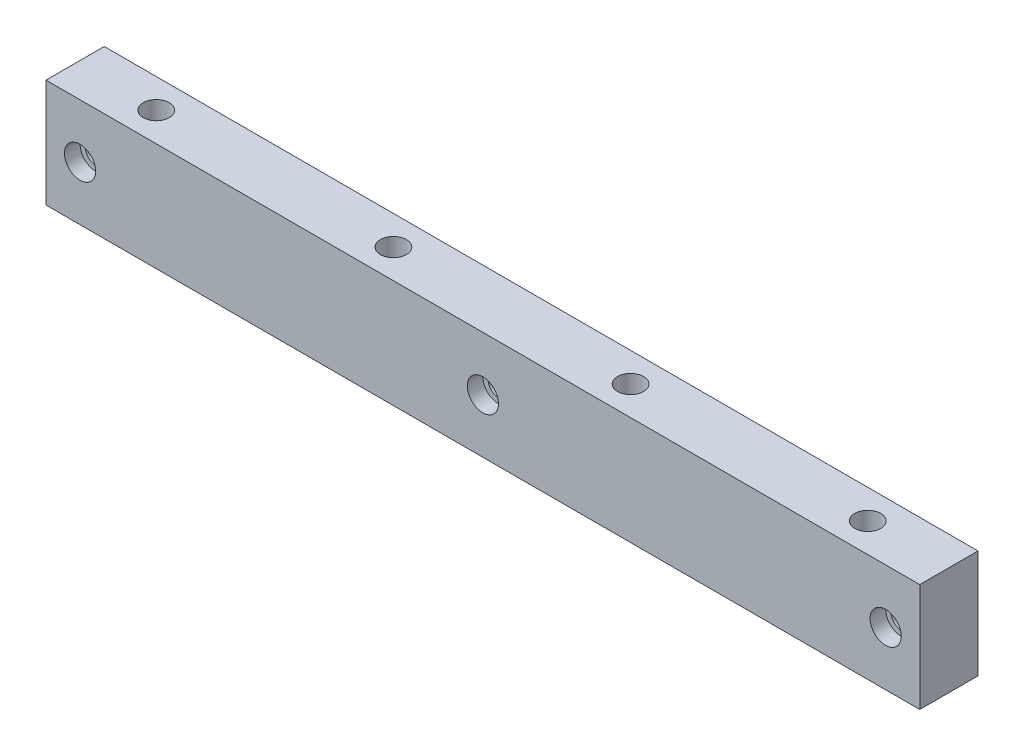
ISO-10303-21;
HEADER;
FILE_DESCRIPTION(('STEP AP214'),'2;1');
FILE_NAME('part.step','',(''),(''),'','','');
FILE_SCHEMA(('AUTOMOTIVE_DESIGN { 1 0 10303 214 1 1 1 1 }'));
ENDSEC;
DATA;
#1=APPLICATION_CONTEXT('core data for automotive mechanical design processes');
#2=APPLICATION_PROTOCOL_DEFINITION('international standard','automotive_design',2000,#1);
#3=PRODUCT_CONTEXT('',#1,'mechanical');
#4=PRODUCT('Part','Part','',(#3));
#5=PRODUCT_RELATED_PRODUCT_CATEGORY('part','',(#4));
#6=PRODUCT_DEFINITION_FORMATION('','',#4);
#7=PRODUCT_DEFINITION_CONTEXT('part definition',#1,'design');
#8=PRODUCT_DEFINITION('design','',#6,#7);
#9=PRODUCT_DEFINITION_SHAPE('','',#8);
#10=(LENGTH_UNIT() NAMED_UNIT(*) SI_UNIT(.MILLI.,.METRE.));
#11=(NAMED_UNIT(*) PLANE_ANGLE_UNIT() SI_UNIT($,.RADIAN.));
#12=(NAMED_UNIT(*) SI_UNIT($,.STERADIAN.) SOLID_ANGLE_UNIT());
#13=UNCERTAINTY_MEASURE_WITH_UNIT(LENGTH_MEASURE(1.E-05),#10,'distance_accuracy_value','');
#14=(GEOMETRIC_REPRESENTATION_CONTEXT(3) GLOBAL_UNCERTAINTY_ASSIGNED_CONTEXT((#13)) GLOBAL_UNIT_ASSIGNED_CONTEXT((#10,
#11,#12)) REPRESENTATION_CONTEXT('',''));
#15=CARTESIAN_POINT('',(0.,0.,0.));
#16=DIRECTION('',(0.,0.,1.));
#17=DIRECTION('',(1.,0.,0.));
#18=AXIS2_PLACEMENT_3D('',#15,#16,#17);
#19=CARTESIAN_POINT('',(-122.951875,-16.51,-26.7602561210691));
#20=DIRECTION('',(0.,0.,1.));
#21=DIRECTION('',(1.,0.,0.));
#22=AXIS2_PLACEMENT_3D('',#19,#20,#21);
#23=CYLINDRICAL_SURFACE('',#22,3.175);
#24=CARTESIAN_POINT('',(-122.951875,-16.51,-17.78));
#25=DIRECTION('',(0.,0.,-1.));
#26=DIRECTION('',(-1.,0.,0.));
#27=AXIS2_PLACEMENT_3D('',#24,#25,#26);
#28=CIRCLE('',#27,3.175);
#29=CARTESIAN_POINT('',(-126.126875,-16.51,-17.78));
#30=VERTEX_POINT('',#29);
#31=EDGE_CURVE('E143',#30,#30,#28,.F.);
#32=ORIENTED_EDGE('',*,*,#31,.F.);
#33=EDGE_LOOP('',(#32));
#34=FACE_BOUND('',#33,.T.);
#35=CARTESIAN_POINT('',(-122.951875,-16.51,-4.7752));
#36=DIRECTION('',(0.,0.,1.));
#37=DIRECTION('',(1.,0.,0.));
#38=AXIS2_PLACEMENT_3D('',#35,#36,#37);
#39=CIRCLE('',#38,3.175);
#40=CARTESIAN_POINT('',(-119.776875,-16.51,-4.7752));
#41=VERTEX_POINT('',#40);
#42=EDGE_CURVE('E45',#41,#41,#39,.F.);
#43=ORIENTED_EDGE('',*,*,#42,.F.);
#44=EDGE_LOOP('',(#43));
#45=FACE_BOUND('',#44,.T.);
#46=ADVANCED_FACE('F41',(#34,#45),#23,.F.);
#47=CARTESIAN_POINT('',(0.,-16.51,-26.7602561210691));
#48=DIRECTION('',(0.,0.,1.));
#49=DIRECTION('',(1.,0.,0.));
#50=AXIS2_PLACEMENT_3D('',#47,#48,#49);
#51=CYLINDRICAL_SURFACE('',#50,3.175);
#52=CARTESIAN_POINT('',(0.,-16.51,-17.78));
#53=DIRECTION('',(0.,0.,-1.));
#54=DIRECTION('',(-1.,0.,0.));
#55=AXIS2_PLACEMENT_3D('',#52,#53,#54);
#56=CIRCLE('',#55,3.175);
#57=CARTESIAN_POINT('',(-3.175,-16.51,-17.78));
#58=VERTEX_POINT('',#57);
#59=EDGE_CURVE('E148',#58,#58,#56,.F.);
#60=ORIENTED_EDGE('',*,*,#59,.F.);
#61=EDGE_LOOP('',(#60));
#62=FACE_BOUND('',#61,.T.);
#63=CARTESIAN_POINT('',(0.,-16.51,-4.7752));
#64=DIRECTION('',(0.,0.,1.));
#65=DIRECTION('',(1.,0.,0.));
#66=AXIS2_PLACEMENT_3D('',#63,#64,#65);
#67=CIRCLE('',#66,3.175);
#68=CARTESIAN_POINT('',(3.175,-16.51,-4.7752));
#69=VERTEX_POINT('',#68);
#70=EDGE_CURVE('E135',#69,#69,#67,.F.);
#71=ORIENTED_EDGE('',*,*,#70,.F.);
#72=EDGE_LOOP('',(#71));
#73=FACE_BOUND('',#72,.T.);
#74=ADVANCED_FACE('F209',(#62,#73),#51,.F.);
#75=CARTESIAN_POINT('',(122.951875,-16.51,-26.7602561210691));
#76=DIRECTION('',(0.,0.,1.));
#77=DIRECTION('',(1.,0.,0.));
#78=AXIS2_PLACEMENT_3D('',#75,#76,#77);
#79=CYLINDRICAL_SURFACE('',#78,3.175);
#80=CARTESIAN_POINT('',(122.951875,-16.51,-17.78));
#81=DIRECTION('',(0.,0.,-1.));
#82=DIRECTION('',(-1.,0.,0.));
#83=AXIS2_PLACEMENT_3D('',#80,#81,#82);
#84=CIRCLE('',#83,3.175);
#85=CARTESIAN_POINT('',(119.776875,-16.51,-17.78));
#86=VERTEX_POINT('',#85);
#87=EDGE_CURVE('E154',#86,#86,#84,.F.);
#88=ORIENTED_EDGE('',*,*,#87,.F.);
#89=EDGE_LOOP('',(#88));
#90=FACE_BOUND('',#89,.T.);
#91=CARTESIAN_POINT('',(122.951875,-16.51,-4.7752));
#92=DIRECTION('',(0.,0.,1.));
#93=DIRECTION('',(1.,0.,0.));
#94=AXIS2_PLACEMENT_3D('',#91,#92,#93);
#95=CIRCLE('',#94,3.175);
#96=CARTESIAN_POINT('',(126.126875,-16.51,-4.7752));
#97=VERTEX_POINT('',#96);
#98=EDGE_CURVE('E132',#97,#97,#95,.F.);
#99=ORIENTED_EDGE('',*,*,#98,.F.);
#100=EDGE_LOOP('',(#99));
#101=FACE_BOUND('',#100,.T.);
#102=ADVANCED_FACE('F205',(#90,#101),#79,.F.);
#103=CARTESIAN_POINT('',(-133.35,-33.02,-17.78));
#104=DIRECTION('',(-1.,0.,0.));
#105=DIRECTION('',(0.,0.,1.));
#106=AXIS2_PLACEMENT_3D('',#103,#104,#105);
#107=PLANE('',#106);
#108=DIRECTION('',(0.,0.,1.));
#109=VECTOR('',#108,1.);
#110=CARTESIAN_POINT('',(-133.35,0.,-17.78));
#111=LINE('',#110,#109);
#112=CARTESIAN_POINT('',(-133.35,0.,-17.78));
#113=VERTEX_POINT('',#112);
#114=CARTESIAN_POINT('',(-133.35,0.,0.));
#115=VERTEX_POINT('',#114);
#116=EDGE_CURVE('E115',#113,#115,#111,.T.);
#117=ORIENTED_EDGE('',*,*,#116,.F.);
#118=DIRECTION('',(0.,1.,0.));
#119=VECTOR('',#118,1.);
#120=CARTESIAN_POINT('',(-133.35,-33.02,-17.78));
#121=LINE('',#120,#119);
#122=CARTESIAN_POINT('',(-133.35,-33.02,-17.78));
#123=VERTEX_POINT('',#122);
#124=EDGE_CURVE('E11',#123,#113,#121,.T.);
#125=ORIENTED_EDGE('',*,*,#124,.F.);
#126=DIRECTION('',(0.,0.,1.));
#127=VECTOR('',#126,1.);
#128=CARTESIAN_POINT('',(-133.35,-33.02,-17.78));
#129=LINE('',#128,#127);
#130=CARTESIAN_POINT('',(-133.35,-33.02,0.));
#131=VERTEX_POINT('',#130);
#132=EDGE_CURVE('E106',#123,#131,#129,.T.);
#133=ORIENTED_EDGE('',*,*,#132,.T.);
#134=DIRECTION('',(0.,1.,0.));
#135=VECTOR('',#134,1.);
#136=CARTESIAN_POINT('',(-133.35,-33.02,0.));
#137=LINE('',#136,#135);
#138=EDGE_CURVE('E86',#131,#115,#137,.T.);
#139=ORIENTED_EDGE('',*,*,#138,.T.);
#140=EDGE_LOOP('',(#117,#125,#133,#139));
#141=FACE_BOUND('',#140,.T.);
#142=ADVANCED_FACE('F43',(#141),#107,.T.);
#143=CARTESIAN_POINT('',(133.35,-33.02,-17.78));
#144=DIRECTION('',(0.,0.,-1.));
#145=DIRECTION('',(-1.,0.,0.));
#146=AXIS2_PLACEMENT_3D('',#143,#144,#145);
#147=PLANE('',#146);
#148=ORIENTED_EDGE('',*,*,#87,.T.);
#149=EDGE_LOOP('',(#148));
#150=FACE_BOUND('',#149,.T.);
#151=ORIENTED_EDGE('',*,*,#59,.T.);
#152=EDGE_LOOP('',(#151));
#153=FACE_BOUND('',#152,.T.);
#154=ORIENTED_EDGE('',*,*,#31,.T.);
#155=EDGE_LOOP('',(#154));
#156=FACE_BOUND('',#155,.T.);
#157=DIRECTION('',(-1.,0.,0.));
#158=VECTOR('',#157,1.);
#159=CARTESIAN_POINT('',(133.35,0.,-17.78));
#160=LINE('',#159,#158);
#161=CARTESIAN_POINT('',(133.35,0.,-17.78));
#162=VERTEX_POINT('',#161);
#163=EDGE_CURVE('E109',#162,#113,#160,.T.);
#164=ORIENTED_EDGE('',*,*,#163,.F.);
#165=DIRECTION('',(0.,1.,0.));
#166=VECTOR('',#165,1.);
#167=CARTESIAN_POINT('',(133.35,-33.02,-17.78));
#168=LINE('',#167,#166);
#169=CARTESIAN_POINT('',(133.35,-33.02,-17.78));
#170=VERTEX_POINT('',#169);
#171=EDGE_CURVE('E52',#170,#162,#168,.T.);
#172=ORIENTED_EDGE('',*,*,#171,.F.);
#173=DIRECTION('',(-1.,0.,0.));
#174=VECTOR('',#173,1.);
#175=CARTESIAN_POINT('',(133.35,-33.02,-17.78));
#176=LINE('',#175,#174);
#177=EDGE_CURVE('E101',#170,#123,#176,.T.);
#178=ORIENTED_EDGE('',*,*,#177,.T.);
#179=ORIENTED_EDGE('',*,*,#124,.T.);
#180=EDGE_LOOP('',(#164,#172,#178,#179));
#181=FACE_BOUND('',#180,.T.);
#182=ADVANCED_FACE('F196',(#150,#153,#156,#181),#147,.T.);
#183=CARTESIAN_POINT('',(133.35,-33.02,-17.78));
#184=DIRECTION('',(1.,0.,0.));
#185=DIRECTION('',(0.,0.,-1.));
#186=AXIS2_PLACEMENT_3D('',#183,#184,#185);
#187=PLANE('',#186);
#188=DIRECTION('',(0.,0.,-1.));
#189=VECTOR('',#188,1.);
#190=CARTESIAN_POINT('',(133.35,0.,-17.78));
#191=LINE('',#190,#189);
#192=CARTESIAN_POINT('',(133.35,0.,0.));
#193=VERTEX_POINT('',#192);
#194=EDGE_CURVE('E94',#193,#162,#191,.T.);
#195=ORIENTED_EDGE('',*,*,#194,.F.);
#196=DIRECTION('',(0.,1.,0.));
#197=VECTOR('',#196,1.);
#198=CARTESIAN_POINT('',(133.35,-33.02,0.));
#199=LINE('',#198,#197);
#200=CARTESIAN_POINT('',(133.35,-33.02,0.));
#201=VERTEX_POINT('',#200);
#202=EDGE_CURVE('E89',#201,#193,#199,.T.);
#203=ORIENTED_EDGE('',*,*,#202,.F.);
#204=DIRECTION('',(0.,0.,-1.));
#205=VECTOR('',#204,1.);
#206=CARTESIAN_POINT('',(133.35,-33.02,-17.78));
#207=LINE('',#206,#205);
#208=EDGE_CURVE('E92',#201,#170,#207,.T.);
#209=ORIENTED_EDGE('',*,*,#208,.T.);
#210=ORIENTED_EDGE('',*,*,#171,.T.);
#211=EDGE_LOOP('',(#195,#203,#209,#210));
#212=FACE_BOUND('',#211,.T.);
#213=ADVANCED_FACE('F91',(#212),#187,.T.);
#214=CARTESIAN_POINT('',(133.35,-33.02,0.));
#215=DIRECTION('',(0.,0.,1.));
#216=DIRECTION('',(1.,0.,0.));
#217=AXIS2_PLACEMENT_3D('',#214,#215,#216);
#218=PLANE('',#217);
#219=CARTESIAN_POINT('',(122.951875,-16.51,0.));
#220=DIRECTION('',(0.,0.,1.));
#221=DIRECTION('',(1.,0.,0.));
#222=AXIS2_PLACEMENT_3D('',#219,#220,#221);
#223=CIRCLE('',#222,4.76250000000001);
#224=CARTESIAN_POINT('',(127.714375,-16.51,0.));
#225=VERTEX_POINT('',#224);
#226=EDGE_CURVE('E262',#225,#225,#223,.T.);
#227=ORIENTED_EDGE('',*,*,#226,.F.);
#228=EDGE_LOOP('',(#227));
#229=FACE_BOUND('',#228,.T.);
#230=CARTESIAN_POINT('',(0.,-16.51,0.));
#231=DIRECTION('',(0.,0.,1.));
#232=DIRECTION('',(1.,0.,0.));
#233=AXIS2_PLACEMENT_3D('',#230,#231,#232);
#234=CIRCLE('',#233,4.7625);
#235=CARTESIAN_POINT('',(4.7625,-16.51,0.));
#236=VERTEX_POINT('',#235);
#237=EDGE_CURVE('E266',#236,#236,#234,.T.);
#238=ORIENTED_EDGE('',*,*,#237,.F.);
#239=EDGE_LOOP('',(#238));
#240=FACE_BOUND('',#239,.T.);
#241=CARTESIAN_POINT('',(-122.951875,-16.51,0.));
#242=DIRECTION('',(0.,0.,1.));
#243=DIRECTION('',(1.,0.,0.));
#244=AXIS2_PLACEMENT_3D('',#241,#242,#243);
#245=CIRCLE('',#244,4.7625);
#246=CARTESIAN_POINT('',(-118.189375,-16.51,0.));
#247=VERTEX_POINT('',#246);
#248=EDGE_CURVE('E269',#247,#247,#245,.T.);
#249=ORIENTED_EDGE('',*,*,#248,.F.);
#250=EDGE_LOOP('',(#249));
#251=FACE_BOUND('',#250,.T.);
#252=DIRECTION('',(1.,0.,0.));
#253=VECTOR('',#252,1.);
#254=CARTESIAN_POINT('',(133.35,0.,0.));
#255=LINE('',#254,#253);
#256=EDGE_CURVE('E119',#115,#193,#255,.T.);
#257=ORIENTED_EDGE('',*,*,#256,.F.);
#258=ORIENTED_EDGE('',*,*,#138,.F.);
#259=DIRECTION('',(1.,0.,0.));
#260=VECTOR('',#259,1.);
#261=CARTESIAN_POINT('',(133.35,-33.02,0.));
#262=LINE('',#261,#260);
#263=EDGE_CURVE('E100',#131,#201,#262,.T.);
#264=ORIENTED_EDGE('',*,*,#263,.T.);
#265=ORIENTED_EDGE('',*,*,#202,.T.);
#266=EDGE_LOOP('',(#257,#258,#264,#265));
#267=FACE_BOUND('',#266,.T.);
#268=ADVANCED_FACE('F104',(#229,#240,#251,#267),#218,.T.);
#269=CARTESIAN_POINT('',(0.,-33.02,0.));
#270=DIRECTION('',(0.,-1.,0.));
#271=DIRECTION('',(0.,0.,-1.));
#272=AXIS2_PLACEMENT_3D('',#269,#270,#271);
#273=PLANE('',#272);
#274=CARTESIAN_POINT('',(-108.585,-33.02,-8.88999999999999));
#275=DIRECTION('',(0.,1.,0.));
#276=DIRECTION('',(0.,0.,1.));
#277=AXIS2_PLACEMENT_3D('',#274,#275,#276);
#278=CIRCLE('',#277,3.96875);
#279=CARTESIAN_POINT('',(-108.585,-33.02,-4.92124999999998));
#280=VERTEX_POINT('',#279);
#281=EDGE_CURVE('E158',#280,#280,#278,.T.);
#282=ORIENTED_EDGE('',*,*,#281,.T.);
#283=EDGE_LOOP('',(#282));
#284=FACE_BOUND('',#283,.T.);
#285=CARTESIAN_POINT('',(-36.195,-33.02,-8.88999999999999));
#286=DIRECTION('',(0.,1.,0.));
#287=DIRECTION('',(0.,0.,1.));
#288=AXIS2_PLACEMENT_3D('',#285,#286,#287);
#289=CIRCLE('',#288,3.96874999999999);
#290=CARTESIAN_POINT('',(-36.195,-33.02,-4.92125));
#291=VERTEX_POINT('',#290);
#292=EDGE_CURVE('E167',#291,#291,#289,.T.);
#293=ORIENTED_EDGE('',*,*,#292,.T.);
#294=EDGE_LOOP('',(#293));
#295=FACE_BOUND('',#294,.T.);
#296=CARTESIAN_POINT('',(36.195,-33.02,-8.89));
#297=DIRECTION('',(0.,1.,0.));
#298=DIRECTION('',(0.,0.,1.));
#299=AXIS2_PLACEMENT_3D('',#296,#297,#298);
#300=CIRCLE('',#299,3.96874999999999);
#301=CARTESIAN_POINT('',(36.195,-33.02,-4.92125000000001));
#302=VERTEX_POINT('',#301);
#303=EDGE_CURVE('E175',#302,#302,#300,.T.);
#304=ORIENTED_EDGE('',*,*,#303,.T.);
#305=EDGE_LOOP('',(#304));
#306=FACE_BOUND('',#305,.T.);
#307=CARTESIAN_POINT('',(108.585,-33.02,-8.89));
#308=DIRECTION('',(0.,1.,0.));
#309=DIRECTION('',(0.,0.,1.));
#310=AXIS2_PLACEMENT_3D('',#307,#308,#309);
#311=CIRCLE('',#310,3.96875);
#312=CARTESIAN_POINT('',(108.585,-33.02,-4.92124999999999));
#313=VERTEX_POINT('',#312);
#314=EDGE_CURVE('E120',#313,#313,#311,.T.);
#315=ORIENTED_EDGE('',*,*,#314,.T.);
#316=EDGE_LOOP('',(#315));
#317=FACE_BOUND('',#316,.T.);
#318=ORIENTED_EDGE('',*,*,#132,.F.);
#319=ORIENTED_EDGE('',*,*,#177,.F.);
#320=ORIENTED_EDGE('',*,*,#208,.F.);
#321=ORIENTED_EDGE('',*,*,#263,.F.);
#322=EDGE_LOOP('',(#318,#319,#320,#321));
#323=FACE_BOUND('',#322,.T.);
#324=ADVANCED_FACE('F99',(#284,#295,#306,#317,#323),#273,.T.);
#325=CARTESIAN_POINT('',(0.,0.,0.));
#326=DIRECTION('',(0.,-1.,0.));
#327=DIRECTION('',(0.,0.,-1.));
#328=AXIS2_PLACEMENT_3D('',#325,#326,#327);
#329=PLANE('',#328);
#330=CARTESIAN_POINT('',(-108.585,0.,-8.88999999999999));
#331=DIRECTION('',(0.,1.,0.));
#332=DIRECTION('',(0.,0.,1.));
#333=AXIS2_PLACEMENT_3D('',#330,#331,#332);
#334=CIRCLE('',#333,3.96875);
#335=CARTESIAN_POINT('',(-108.585,0.,-4.92124999999998));
#336=VERTEX_POINT('',#335);
#337=EDGE_CURVE('E163',#336,#336,#334,.T.);
#338=ORIENTED_EDGE('',*,*,#337,.F.);
#339=EDGE_LOOP('',(#338));
#340=FACE_BOUND('',#339,.T.);
#341=CARTESIAN_POINT('',(-36.195,0.,-8.88999999999999));
#342=DIRECTION('',(0.,1.,0.));
#343=DIRECTION('',(0.,0.,1.));
#344=AXIS2_PLACEMENT_3D('',#341,#342,#343);
#345=CIRCLE('',#344,3.96874999999999);
#346=CARTESIAN_POINT('',(-36.195,0.,-4.92125));
#347=VERTEX_POINT('',#346);
#348=EDGE_CURVE('E162',#347,#347,#345,.T.);
#349=ORIENTED_EDGE('',*,*,#348,.F.);
#350=EDGE_LOOP('',(#349));
#351=FACE_BOUND('',#350,.T.);
#352=CARTESIAN_POINT('',(36.195,0.,-8.89));
#353=DIRECTION('',(0.,1.,0.));
#354=DIRECTION('',(0.,0.,1.));
#355=AXIS2_PLACEMENT_3D('',#352,#353,#354);
#356=CIRCLE('',#355,3.96874999999999);
#357=CARTESIAN_POINT('',(36.195,0.,-4.92125000000001));
#358=VERTEX_POINT('',#357);
#359=EDGE_CURVE('E171',#358,#358,#356,.T.);
#360=ORIENTED_EDGE('',*,*,#359,.F.);
#361=EDGE_LOOP('',(#360));
#362=FACE_BOUND('',#361,.T.);
#363=CARTESIAN_POINT('',(108.585,0.,-8.89));
#364=DIRECTION('',(0.,1.,0.));
#365=DIRECTION('',(0.,0.,1.));
#366=AXIS2_PLACEMENT_3D('',#363,#364,#365);
#367=CIRCLE('',#366,3.96875);
#368=CARTESIAN_POINT('',(108.585,0.,-4.92124999999999));
#369=VERTEX_POINT('',#368);
#370=EDGE_CURVE('E179',#369,#369,#367,.T.);
#371=ORIENTED_EDGE('',*,*,#370,.F.);
#372=EDGE_LOOP('',(#371));
#373=FACE_BOUND('',#372,.T.);
#374=ORIENTED_EDGE('',*,*,#116,.T.);
#375=ORIENTED_EDGE('',*,*,#256,.T.);
#376=ORIENTED_EDGE('',*,*,#194,.T.);
#377=ORIENTED_EDGE('',*,*,#163,.T.);
#378=EDGE_LOOP('',(#374,#375,#376,#377));
#379=FACE_BOUND('',#378,.T.);
#380=ADVANCED_FACE('F191',(#340,#351,#362,#373,#379),#329,.F.);
#381=CARTESIAN_POINT('',(108.585,-33.02,-8.89));
#382=DIRECTION('',(0.,1.,0.));
#383=DIRECTION('',(0.,0.,1.));
#384=AXIS2_PLACEMENT_3D('',#381,#382,#383);
#385=CYLINDRICAL_SURFACE('',#384,3.96875);
#386=ORIENTED_EDGE('',*,*,#314,.F.);
#387=EDGE_LOOP('',(#386));
#388=FACE_BOUND('',#387,.T.);
#389=ORIENTED_EDGE('',*,*,#370,.T.);
#390=EDGE_LOOP('',(#389));
#391=FACE_BOUND('',#390,.T.);
#392=ADVANCED_FACE('F189',(#388,#391),#385,.F.);
#393=CARTESIAN_POINT('',(36.195,-33.02,-8.89));
#394=DIRECTION('',(0.,1.,0.));
#395=DIRECTION('',(0.,0.,1.));
#396=AXIS2_PLACEMENT_3D('',#393,#394,#395);
#397=CYLINDRICAL_SURFACE('',#396,3.96874999999999);
#398=ORIENTED_EDGE('',*,*,#303,.F.);
#399=EDGE_LOOP('',(#398));
#400=FACE_BOUND('',#399,.T.);
#401=ORIENTED_EDGE('',*,*,#359,.T.);
#402=EDGE_LOOP('',(#401));
#403=FACE_BOUND('',#402,.T.);
#404=ADVANCED_FACE('F228',(#400,#403),#397,.F.);
#405=CARTESIAN_POINT('',(-36.195,-33.02,-8.88999999999999));
#406=DIRECTION('',(0.,1.,0.));
#407=DIRECTION('',(0.,0.,1.));
#408=AXIS2_PLACEMENT_3D('',#405,#406,#407);
#409=CYLINDRICAL_SURFACE('',#408,3.96874999999999);
#410=ORIENTED_EDGE('',*,*,#292,.F.);
#411=EDGE_LOOP('',(#410));
#412=FACE_BOUND('',#411,.T.);
#413=ORIENTED_EDGE('',*,*,#348,.T.);
#414=EDGE_LOOP('',(#413));
#415=FACE_BOUND('',#414,.T.);
#416=ADVANCED_FACE('F224',(#412,#415),#409,.F.);
#417=CARTESIAN_POINT('',(-108.585,-33.02,-8.88999999999999));
#418=DIRECTION('',(0.,1.,0.));
#419=DIRECTION('',(0.,0.,1.));
#420=AXIS2_PLACEMENT_3D('',#417,#418,#419);
#421=CYLINDRICAL_SURFACE('',#420,3.96875);
#422=ORIENTED_EDGE('',*,*,#281,.F.);
#423=EDGE_LOOP('',(#422));
#424=FACE_BOUND('',#423,.T.);
#425=ORIENTED_EDGE('',*,*,#337,.T.);
#426=EDGE_LOOP('',(#425));
#427=FACE_BOUND('',#426,.T.);
#428=ADVANCED_FACE('F220',(#424,#427),#421,.F.);
#429=CARTESIAN_POINT('',(122.951875,-16.51,-4.7752));
#430=DIRECTION('',(0.,0.,1.));
#431=DIRECTION('',(1.,0.,0.));
#432=AXIS2_PLACEMENT_3D('',#429,#430,#431);
#433=PLANE('',#432);
#434=CARTESIAN_POINT('',(122.951875,-16.51,-4.7752));
#435=DIRECTION('',(0.,0.,1.));
#436=DIRECTION('',(1.,0.,0.));
#437=AXIS2_PLACEMENT_3D('',#434,#435,#436);
#438=CIRCLE('',#437,4.76250000000001);
#439=CARTESIAN_POINT('',(127.714375,-16.51,-4.7752));
#440=VERTEX_POINT('',#439);
#441=EDGE_CURVE('E136',#440,#440,#438,.T.);
#442=ORIENTED_EDGE('',*,*,#441,.T.);
#443=EDGE_LOOP('',(#442));
#444=FACE_BOUND('',#443,.T.);
#445=ORIENTED_EDGE('',*,*,#98,.T.);
#446=EDGE_LOOP('',(#445));
#447=FACE_BOUND('',#446,.T.);
#448=ADVANCED_FACE('F223',(#444,#447),#433,.T.);
#449=CARTESIAN_POINT('',(122.951875,-16.51,-4.7752));
#450=DIRECTION('',(0.,0.,1.));
#451=DIRECTION('',(1.,0.,0.));
#452=AXIS2_PLACEMENT_3D('',#449,#450,#451);
#453=CYLINDRICAL_SURFACE('',#452,4.76250000000001);
#454=ORIENTED_EDGE('',*,*,#441,.F.);
#455=EDGE_LOOP('',(#454));
#456=FACE_BOUND('',#455,.T.);
#457=ORIENTED_EDGE('',*,*,#226,.T.);
#458=EDGE_LOOP('',(#457));
#459=FACE_BOUND('',#458,.T.);
#460=ADVANCED_FACE('F286',(#456,#459),#453,.F.);
#461=CARTESIAN_POINT('',(0.,-16.51,-4.7752));
#462=DIRECTION('',(0.,0.,1.));
#463=DIRECTION('',(1.,0.,0.));
#464=AXIS2_PLACEMENT_3D('',#461,#462,#463);
#465=PLANE('',#464);
#466=CARTESIAN_POINT('',(0.,-16.51,-4.7752));
#467=DIRECTION('',(0.,0.,1.));
#468=DIRECTION('',(1.,0.,0.));
#469=AXIS2_PLACEMENT_3D('',#466,#467,#468);
#470=CIRCLE('',#469,4.7625);
#471=CARTESIAN_POINT('',(4.7625,-16.51,-4.7752));
#472=VERTEX_POINT('',#471);
#473=EDGE_CURVE('E421',#472,#472,#470,.T.);
#474=ORIENTED_EDGE('',*,*,#473,.T.);
#475=EDGE_LOOP('',(#474));
#476=FACE_BOUND('',#475,.T.);
#477=ORIENTED_EDGE('',*,*,#70,.T.);
#478=EDGE_LOOP('',(#477));
#479=FACE_BOUND('',#478,.T.);
#480=ADVANCED_FACE('F292',(#476,#479),#465,.T.);
#481=CARTESIAN_POINT('',(0.,-16.51,-4.7752));
#482=DIRECTION('',(0.,0.,1.));
#483=DIRECTION('',(1.,0.,0.));
#484=AXIS2_PLACEMENT_3D('',#481,#482,#483);
#485=CYLINDRICAL_SURFACE('',#484,4.7625);
#486=ORIENTED_EDGE('',*,*,#473,.F.);
#487=EDGE_LOOP('',(#486));
#488=FACE_BOUND('',#487,.T.);
#489=ORIENTED_EDGE('',*,*,#237,.T.);
#490=EDGE_LOOP('',(#489));
#491=FACE_BOUND('',#490,.T.);
#492=ADVANCED_FACE('F299',(#488,#491),#485,.F.);
#493=CARTESIAN_POINT('',(-122.951875,-16.51,-4.7752));
#494=DIRECTION('',(0.,0.,1.));
#495=DIRECTION('',(1.,0.,0.));
#496=AXIS2_PLACEMENT_3D('',#493,#494,#495);
#497=PLANE('',#496);
#498=CARTESIAN_POINT('',(-122.951875,-16.51,-4.7752));
#499=DIRECTION('',(0.,0.,1.));
#500=DIRECTION('',(1.,0.,0.));
#501=AXIS2_PLACEMENT_3D('',#498,#499,#500);
#502=CIRCLE('',#501,4.7625);
#503=CARTESIAN_POINT('',(-118.189375,-16.51,-4.7752));
#504=VERTEX_POINT('',#503);
#505=EDGE_CURVE('E272',#504,#504,#502,.T.);
#506=ORIENTED_EDGE('',*,*,#505,.T.);
#507=EDGE_LOOP('',(#506));
#508=FACE_BOUND('',#507,.T.);
#509=ORIENTED_EDGE('',*,*,#42,.T.);
#510=EDGE_LOOP('',(#509));
#511=FACE_BOUND('',#510,.T.);
#512=ADVANCED_FACE('F303',(#508,#511),#497,.T.);
#513=CARTESIAN_POINT('',(-122.951875,-16.51,-4.7752));
#514=DIRECTION('',(0.,0.,1.));
#515=DIRECTION('',(1.,0.,0.));
#516=AXIS2_PLACEMENT_3D('',#513,#514,#515);
#517=CYLINDRICAL_SURFACE('',#516,4.7625);
#518=ORIENTED_EDGE('',*,*,#505,.F.);
#519=EDGE_LOOP('',(#518));
#520=FACE_BOUND('',#519,.T.);
#521=ORIENTED_EDGE('',*,*,#248,.T.);
#522=EDGE_LOOP('',(#521));
#523=FACE_BOUND('',#522,.T.);
#524=ADVANCED_FACE('F307',(#520,#523),#517,.F.);
#525=CLOSED_SHELL('',(#46,#74,#102,#142,#182,#213,#268,#324,#380,#392,#404,#416,#428,#448,#460,
#480,#492,#512,#524));
#526=MANIFOLD_SOLID_BREP('B2',#525);
#527=ADVANCED_BREP_SHAPE_REPRESENTATION('',(#18,#526),#14);
#528=SHAPE_DEFINITION_REPRESENTATION(#9,#527);
ENDSEC;
END-ISO-10303-21;
